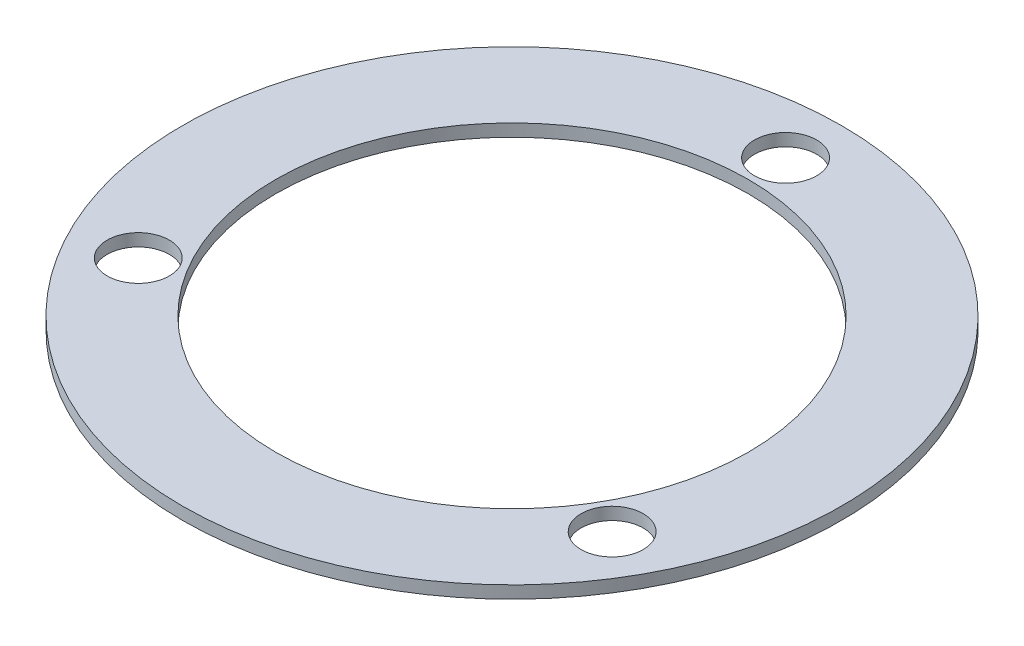
ISO-10303-21;
HEADER;
FILE_DESCRIPTION(('STEP AP214'),'2;1');
FILE_NAME('part.step','',(''),(''),'','','');
FILE_SCHEMA(('AUTOMOTIVE_DESIGN { 1 0 10303 214 1 1 1 1 }'));
ENDSEC;
DATA;
#1=APPLICATION_CONTEXT('core data for automotive mechanical design processes');
#2=APPLICATION_PROTOCOL_DEFINITION('international standard','automotive_design',2000,#1);
#3=PRODUCT_CONTEXT('',#1,'mechanical');
#4=PRODUCT('Part','Part','',(#3));
#5=PRODUCT_RELATED_PRODUCT_CATEGORY('part','',(#4));
#6=PRODUCT_DEFINITION_FORMATION('','',#4);
#7=PRODUCT_DEFINITION_CONTEXT('part definition',#1,'design');
#8=PRODUCT_DEFINITION('design','',#6,#7);
#9=PRODUCT_DEFINITION_SHAPE('','',#8);
#10=(LENGTH_UNIT() NAMED_UNIT(*) SI_UNIT(.MILLI.,.METRE.));
#11=(NAMED_UNIT(*) PLANE_ANGLE_UNIT() SI_UNIT($,.RADIAN.));
#12=(NAMED_UNIT(*) SI_UNIT($,.STERADIAN.) SOLID_ANGLE_UNIT());
#13=UNCERTAINTY_MEASURE_WITH_UNIT(LENGTH_MEASURE(1.E-05),#10,'distance_accuracy_value','');
#14=(GEOMETRIC_REPRESENTATION_CONTEXT(3) GLOBAL_UNCERTAINTY_ASSIGNED_CONTEXT((#13)) GLOBAL_UNIT_ASSIGNED_CONTEXT((#10,
#11,#12)) REPRESENTATION_CONTEXT('',''));
#15=CARTESIAN_POINT('',(0.,0.,0.));
#16=DIRECTION('',(0.,0.,1.));
#17=DIRECTION('',(1.,0.,0.));
#18=AXIS2_PLACEMENT_3D('',#15,#16,#17);
#19=CARTESIAN_POINT('',(0.,0.5,0.));
#20=DIRECTION('',(0.,1.,0.));
#21=DIRECTION('',(0.,0.,1.));
#22=AXIS2_PLACEMENT_3D('',#19,#20,#21);
#23=PLANE('',#22);
#24=CARTESIAN_POINT('',(9.52627944162953,0.5,5.49999999999959));
#25=DIRECTION('',(0.,1.,0.));
#26=DIRECTION('',(0.,0.,1.));
#27=AXIS2_PLACEMENT_3D('',#24,#25,#26);
#28=CIRCLE('',#27,1.25000000000061);
#29=CARTESIAN_POINT('',(9.52627944162953,0.5,6.7500000000002));
#30=VERTEX_POINT('',#29);
#31=EDGE_CURVE('E67',#30,#30,#28,.T.);
#32=ORIENTED_EDGE('',*,*,#31,.F.);
#33=EDGE_LOOP('',(#32));
#34=FACE_BOUND('',#33,.T.);
#35=CARTESIAN_POINT('',(0.,0.5,0.));
#36=DIRECTION('',(0.,1.,0.));
#37=DIRECTION('',(0.,0.,1.));
#38=AXIS2_PLACEMENT_3D('',#35,#36,#37);
#39=CIRCLE('',#38,9.5);
#40=CARTESIAN_POINT('',(0.,0.5,9.5));
#41=VERTEX_POINT('',#40);
#42=EDGE_CURVE('E53',#41,#41,#39,.T.);
#43=ORIENTED_EDGE('',*,*,#42,.F.);
#44=EDGE_LOOP('',(#43));
#45=FACE_BOUND('',#44,.T.);
#46=CARTESIAN_POINT('',(0.,0.5,0.));
#47=DIRECTION('',(0.,1.,0.));
#48=DIRECTION('',(0.,0.,1.));
#49=AXIS2_PLACEMENT_3D('',#46,#47,#48);
#50=CIRCLE('',#49,13.25);
#51=CARTESIAN_POINT('',(0.,0.5,13.25));
#52=VERTEX_POINT('',#51);
#53=EDGE_CURVE('E10',#52,#52,#50,.T.);
#54=ORIENTED_EDGE('',*,*,#53,.T.);
#55=EDGE_LOOP('',(#54));
#56=FACE_BOUND('',#55,.T.);
#57=CARTESIAN_POINT('',(0.,0.5,-11.));
#58=DIRECTION('',(0.,1.,0.));
#59=DIRECTION('',(0.,0.,1.));
#60=AXIS2_PLACEMENT_3D('',#57,#58,#59);
#61=CIRCLE('',#60,1.25);
#62=CARTESIAN_POINT('',(0.,0.5,-9.75));
#63=VERTEX_POINT('',#62);
#64=EDGE_CURVE('E59',#63,#63,#61,.T.);
#65=ORIENTED_EDGE('',*,*,#64,.F.);
#66=EDGE_LOOP('',(#65));
#67=FACE_BOUND('',#66,.T.);
#68=CARTESIAN_POINT('',(-9.52627944162812,0.5,5.50000000000041));
#69=DIRECTION('',(0.,1.,0.));
#70=DIRECTION('',(0.,0.,1.));
#71=AXIS2_PLACEMENT_3D('',#68,#69,#70);
#72=CIRCLE('',#71,1.25000000000089);
#73=CARTESIAN_POINT('',(-9.52627944162812,0.5,6.7500000000013));
#74=VERTEX_POINT('',#73);
#75=EDGE_CURVE('E75',#74,#74,#72,.T.);
#76=ORIENTED_EDGE('',*,*,#75,.F.);
#77=EDGE_LOOP('',(#76));
#78=FACE_BOUND('',#77,.T.);
#79=ADVANCED_FACE('F40',(#34,#45,#56,#67,#78),#23,.T.);
#80=CARTESIAN_POINT('',(0.,0.,0.));
#81=DIRECTION('',(0.,1.,0.));
#82=DIRECTION('',(0.,0.,1.));
#83=AXIS2_PLACEMENT_3D('',#80,#81,#82);
#84=PLANE('',#83);
#85=CARTESIAN_POINT('',(0.,0.,0.));
#86=DIRECTION('',(0.,1.,0.));
#87=DIRECTION('',(0.,0.,1.));
#88=AXIS2_PLACEMENT_3D('',#85,#86,#87);
#89=CIRCLE('',#88,13.25);
#90=CARTESIAN_POINT('',(0.,0.,13.25));
#91=VERTEX_POINT('',#90);
#92=EDGE_CURVE('E44',#91,#91,#89,.T.);
#93=ORIENTED_EDGE('',*,*,#92,.F.);
#94=EDGE_LOOP('',(#93));
#95=FACE_BOUND('',#94,.T.);
#96=CARTESIAN_POINT('',(0.,0.,0.));
#97=DIRECTION('',(0.,1.,0.));
#98=DIRECTION('',(0.,0.,1.));
#99=AXIS2_PLACEMENT_3D('',#96,#97,#98);
#100=CIRCLE('',#99,9.5);
#101=CARTESIAN_POINT('',(0.,0.,9.5));
#102=VERTEX_POINT('',#101);
#103=EDGE_CURVE('E55',#102,#102,#100,.T.);
#104=ORIENTED_EDGE('',*,*,#103,.T.);
#105=EDGE_LOOP('',(#104));
#106=FACE_BOUND('',#105,.T.);
#107=CARTESIAN_POINT('',(0.,0.,-11.));
#108=DIRECTION('',(0.,1.,0.));
#109=DIRECTION('',(0.,0.,1.));
#110=AXIS2_PLACEMENT_3D('',#107,#108,#109);
#111=CIRCLE('',#110,1.25);
#112=CARTESIAN_POINT('',(0.,0.,-9.75));
#113=VERTEX_POINT('',#112);
#114=EDGE_CURVE('E63',#113,#113,#111,.T.);
#115=ORIENTED_EDGE('',*,*,#114,.T.);
#116=EDGE_LOOP('',(#115));
#117=FACE_BOUND('',#116,.T.);
#118=CARTESIAN_POINT('',(9.52627944162953,0.,5.49999999999959));
#119=DIRECTION('',(0.,1.,0.));
#120=DIRECTION('',(0.,0.,1.));
#121=AXIS2_PLACEMENT_3D('',#118,#119,#120);
#122=CIRCLE('',#121,1.25000000000061);
#123=CARTESIAN_POINT('',(9.52627944162953,0.,6.7500000000002));
#124=VERTEX_POINT('',#123);
#125=EDGE_CURVE('E71',#124,#124,#122,.T.);
#126=ORIENTED_EDGE('',*,*,#125,.T.);
#127=EDGE_LOOP('',(#126));
#128=FACE_BOUND('',#127,.T.);
#129=CARTESIAN_POINT('',(-9.52627944162812,0.,5.50000000000041));
#130=DIRECTION('',(0.,1.,0.));
#131=DIRECTION('',(0.,0.,1.));
#132=AXIS2_PLACEMENT_3D('',#129,#130,#131);
#133=CIRCLE('',#132,1.25000000000089);
#134=CARTESIAN_POINT('',(-9.52627944162812,0.,6.7500000000013));
#135=VERTEX_POINT('',#134);
#136=EDGE_CURVE('E79',#135,#135,#133,.T.);
#137=ORIENTED_EDGE('',*,*,#136,.T.);
#138=EDGE_LOOP('',(#137));
#139=FACE_BOUND('',#138,.T.);
#140=ADVANCED_FACE('F91',(#95,#106,#117,#128,#139),#84,.F.);
#141=CARTESIAN_POINT('',(0.,0.5,0.));
#142=DIRECTION('',(0.,-1.,0.));
#143=DIRECTION('',(0.,0.,-1.));
#144=AXIS2_PLACEMENT_3D('',#141,#142,#143);
#145=CYLINDRICAL_SURFACE('',#144,13.25);
#146=ORIENTED_EDGE('',*,*,#53,.F.);
#147=EDGE_LOOP('',(#146));
#148=FACE_BOUND('',#147,.T.);
#149=ORIENTED_EDGE('',*,*,#92,.T.);
#150=EDGE_LOOP('',(#149));
#151=FACE_BOUND('',#150,.T.);
#152=ADVANCED_FACE('F42',(#148,#151),#145,.T.);
#153=CARTESIAN_POINT('',(0.,0.5,0.));
#154=DIRECTION('',(0.,-1.,0.));
#155=DIRECTION('',(0.,0.,-1.));
#156=AXIS2_PLACEMENT_3D('',#153,#154,#155);
#157=CYLINDRICAL_SURFACE('',#156,9.5);
#158=ORIENTED_EDGE('',*,*,#42,.T.);
#159=EDGE_LOOP('',(#158));
#160=FACE_BOUND('',#159,.T.);
#161=ORIENTED_EDGE('',*,*,#103,.F.);
#162=EDGE_LOOP('',(#161));
#163=FACE_BOUND('',#162,.T.);
#164=ADVANCED_FACE('F101',(#160,#163),#157,.F.);
#165=CARTESIAN_POINT('',(0.,0.5,-11.));
#166=DIRECTION('',(0.,-1.,0.));
#167=DIRECTION('',(0.,0.,-1.));
#168=AXIS2_PLACEMENT_3D('',#165,#166,#167);
#169=CYLINDRICAL_SURFACE('',#168,1.25);
#170=ORIENTED_EDGE('',*,*,#64,.T.);
#171=EDGE_LOOP('',(#170));
#172=FACE_BOUND('',#171,.T.);
#173=ORIENTED_EDGE('',*,*,#114,.F.);
#174=EDGE_LOOP('',(#173));
#175=FACE_BOUND('',#174,.T.);
#176=ADVANCED_FACE('F104',(#172,#175),#169,.F.);
#177=CARTESIAN_POINT('',(9.52627944162953,0.5,5.49999999999959));
#178=DIRECTION('',(0.,-1.,0.));
#179=DIRECTION('',(0.,0.,-1.));
#180=AXIS2_PLACEMENT_3D('',#177,#178,#179);
#181=CYLINDRICAL_SURFACE('',#180,1.25000000000061);
#182=ORIENTED_EDGE('',*,*,#31,.T.);
#183=EDGE_LOOP('',(#182));
#184=FACE_BOUND('',#183,.T.);
#185=ORIENTED_EDGE('',*,*,#125,.F.);
#186=EDGE_LOOP('',(#185));
#187=FACE_BOUND('',#186,.T.);
#188=ADVANCED_FACE('F108',(#184,#187),#181,.F.);
#189=CARTESIAN_POINT('',(-9.52627944162812,0.5,5.50000000000041));
#190=DIRECTION('',(0.,-1.,0.));
#191=DIRECTION('',(0.,0.,-1.));
#192=AXIS2_PLACEMENT_3D('',#189,#190,#191);
#193=CYLINDRICAL_SURFACE('',#192,1.25000000000089);
#194=ORIENTED_EDGE('',*,*,#75,.T.);
#195=EDGE_LOOP('',(#194));
#196=FACE_BOUND('',#195,.T.);
#197=ORIENTED_EDGE('',*,*,#136,.F.);
#198=EDGE_LOOP('',(#197));
#199=FACE_BOUND('',#198,.T.);
#200=ADVANCED_FACE('F87',(#196,#199),#193,.F.);
#201=CLOSED_SHELL('',(#79,#140,#152,#164,#176,#188,#200));
#202=MANIFOLD_SOLID_BREP('B2',#201);
#203=ADVANCED_BREP_SHAPE_REPRESENTATION('',(#18,#202),#14);
#204=SHAPE_DEFINITION_REPRESENTATION(#9,#203);
ENDSEC;
END-ISO-10303-21;
